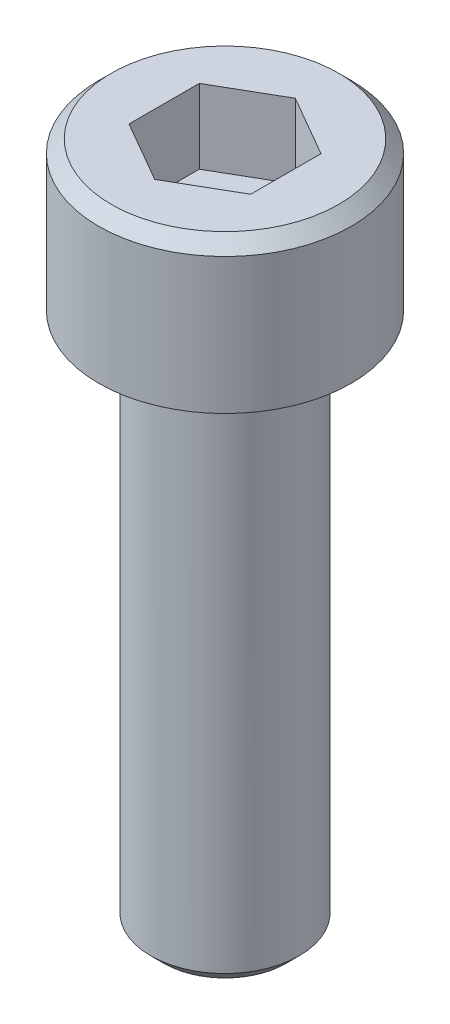
ISO-10303-21;
HEADER;
FILE_DESCRIPTION(('STEP AP214'),'2;1');
FILE_NAME('part.step','',(''),(''),'','','');
FILE_SCHEMA(('AUTOMOTIVE_DESIGN { 1 0 10303 214 1 1 1 1 }'));
ENDSEC;
DATA;
#1=APPLICATION_CONTEXT('core data for automotive mechanical design processes');
#2=APPLICATION_PROTOCOL_DEFINITION('international standard','automotive_design',2000,#1);
#3=PRODUCT_CONTEXT('',#1,'mechanical');
#4=PRODUCT('Part','Part','',(#3));
#5=PRODUCT_RELATED_PRODUCT_CATEGORY('part','',(#4));
#6=PRODUCT_DEFINITION_FORMATION('','',#4);
#7=PRODUCT_DEFINITION_CONTEXT('part definition',#1,'design');
#8=PRODUCT_DEFINITION('design','',#6,#7);
#9=PRODUCT_DEFINITION_SHAPE('','',#8);
#10=(LENGTH_UNIT() NAMED_UNIT(*) SI_UNIT(.MILLI.,.METRE.));
#11=(NAMED_UNIT(*) PLANE_ANGLE_UNIT() SI_UNIT($,.RADIAN.));
#12=(NAMED_UNIT(*) SI_UNIT($,.STERADIAN.) SOLID_ANGLE_UNIT());
#13=UNCERTAINTY_MEASURE_WITH_UNIT(LENGTH_MEASURE(1.E-05),#10,'distance_accuracy_value','');
#14=(GEOMETRIC_REPRESENTATION_CONTEXT(3) GLOBAL_UNCERTAINTY_ASSIGNED_CONTEXT((#13)) GLOBAL_UNIT_ASSIGNED_CONTEXT((#10,
#11,#12)) REPRESENTATION_CONTEXT('',''));
#15=CARTESIAN_POINT('',(0.,0.,0.));
#16=DIRECTION('',(0.,0.,1.));
#17=DIRECTION('',(1.,0.,0.));
#18=AXIS2_PLACEMENT_3D('',#15,#16,#17);
#19=CARTESIAN_POINT('',(-2.0475,2.5,2.364249352));
#20=DIRECTION('',(0.,-1.,0.));
#21=DIRECTION('',(0.,0.,-1.));
#22=AXIS2_PLACEMENT_3D('',#19,#20,#21);
#23=PLANE('',#22);
#24=DIRECTION('',(0.866025403814798,0.,0.499999999947417));
#25=VECTOR('',#24,1.);
#26=CARTESIAN_POINT('',(-1.02375,2.5,1.773187014));
#27=LINE('',#26,#25);
#28=CARTESIAN_POINT('',(-2.0475,2.5,1.182124676));
#29=VERTEX_POINT('',#28);
#30=CARTESIAN_POINT('',(1.14458746300339E-09,2.5,2.36424935133917));
#31=VERTEX_POINT('',#30);
#32=EDGE_CURVE('E78',#29,#31,#27,.T.);
#33=ORIENTED_EDGE('',*,*,#32,.T.);
#34=DIRECTION('',(0.866025403814798,0.,-0.499999999947417));
#35=VECTOR('',#34,1.);
#36=CARTESIAN_POINT('',(1.02375,2.5,1.773187014));
#37=LINE('',#36,#35);
#38=CARTESIAN_POINT('',(2.0475,2.5,1.182124676));
#39=VERTEX_POINT('',#38);
#40=EDGE_CURVE('E95',#31,#39,#37,.T.);
#41=ORIENTED_EDGE('',*,*,#40,.T.);
#42=DIRECTION('',(0.,0.,-1.));
#43=VECTOR('',#42,1.);
#44=CARTESIAN_POINT('',(2.0475,2.5,0.));
#45=LINE('',#44,#43);
#46=CARTESIAN_POINT('',(2.0475,2.5,-1.182124676));
#47=VERTEX_POINT('',#46);
#48=EDGE_CURVE('E98',#39,#47,#45,.T.);
#49=ORIENTED_EDGE('',*,*,#48,.T.);
#50=DIRECTION('',(-0.866025403814798,0.,-0.499999999947417));
#51=VECTOR('',#50,1.);
#52=CARTESIAN_POINT('',(1.02375,2.5,-1.773187014));
#53=LINE('',#52,#51);
#54=CARTESIAN_POINT('',(-1.14458746300339E-09,2.5,-2.36424935133917));
#55=VERTEX_POINT('',#54);
#56=EDGE_CURVE('E101',#47,#55,#53,.T.);
#57=ORIENTED_EDGE('',*,*,#56,.T.);
#58=DIRECTION('',(-0.866025403814798,0.,0.499999999947417));
#59=VECTOR('',#58,1.);
#60=CARTESIAN_POINT('',(-1.02375,2.5,-1.773187014));
#61=LINE('',#60,#59);
#62=CARTESIAN_POINT('',(-2.0475,2.5,-1.182124676));
#63=VERTEX_POINT('',#62);
#64=EDGE_CURVE('E80',#55,#63,#61,.T.);
#65=ORIENTED_EDGE('',*,*,#64,.T.);
#66=DIRECTION('',(0.,0.,1.));
#67=VECTOR('',#66,1.);
#68=CARTESIAN_POINT('',(-2.0475,2.5,0.));
#69=LINE('',#68,#67);
#70=EDGE_CURVE('E76',#63,#29,#69,.T.);
#71=ORIENTED_EDGE('',*,*,#70,.T.);
#72=EDGE_LOOP('',(#33,#41,#49,#57,#65,#71));
#73=FACE_BOUND('',#72,.T.);
#74=ADVANCED_FACE('F16',(#73),#23,.F.);
#75=CARTESIAN_POINT('',(-2.0475,2.5,-1.182124676));
#76=DIRECTION('',(-1.,0.,0.));
#77=DIRECTION('',(0.,0.,1.));
#78=AXIS2_PLACEMENT_3D('',#75,#76,#77);
#79=PLANE('',#78);
#80=DIRECTION('',(0.,-1.,0.));
#81=VECTOR('',#80,1.);
#82=CARTESIAN_POINT('',(-2.0475,3.75,1.182124676));
#83=LINE('',#82,#81);
#84=CARTESIAN_POINT('',(-2.04749999865846,5.,1.18212467509969));
#85=VERTEX_POINT('',#84);
#86=EDGE_CURVE('E82',#85,#29,#83,.T.);
#87=ORIENTED_EDGE('',*,*,#86,.T.);
#88=ORIENTED_EDGE('',*,*,#70,.F.);
#89=DIRECTION('',(0.,1.,0.));
#90=VECTOR('',#89,1.);
#91=CARTESIAN_POINT('',(-2.0475,3.75,-1.182124676));
#92=LINE('',#91,#90);
#93=CARTESIAN_POINT('',(-2.04749999865846,5.,-1.18212467509969));
#94=VERTEX_POINT('',#93);
#95=EDGE_CURVE('E50',#63,#94,#92,.T.);
#96=ORIENTED_EDGE('',*,*,#95,.T.);
#97=DIRECTION('',(0.,0.,-1.));
#98=VECTOR('',#97,1.);
#99=CARTESIAN_POINT('',(-2.0474999978004,5.,0.));
#100=LINE('',#99,#98);
#101=EDGE_CURVE('E56',#85,#94,#100,.T.);
#102=ORIENTED_EDGE('',*,*,#101,.F.);
#103=EDGE_LOOP('',(#87,#88,#96,#102));
#104=FACE_BOUND('',#103,.T.);
#105=ADVANCED_FACE('F83',(#104),#79,.F.);
#106=CARTESIAN_POINT('',(0.,2.5,-2.364249352));
#107=DIRECTION('',(-0.499999999947417,0.,-0.866025403814797));
#108=DIRECTION('',(-0.866025403814797,0.,0.499999999947417));
#109=AXIS2_PLACEMENT_3D('',#106,#107,#108);
#110=PLANE('',#109);
#111=ORIENTED_EDGE('',*,*,#95,.F.);
#112=ORIENTED_EDGE('',*,*,#64,.F.);
#113=DIRECTION('',(0.,1.,0.));
#114=VECTOR('',#113,1.);
#115=CARTESIAN_POINT('',(0.,3.75,-2.364249352));
#116=LINE('',#115,#114);
#117=CARTESIAN_POINT('',(2.08538635865938E-10,5.,-2.3642493506756));
#118=VERTEX_POINT('',#117);
#119=EDGE_CURVE('E100',#55,#118,#116,.T.);
#120=ORIENTED_EDGE('',*,*,#119,.T.);
#121=DIRECTION('',(0.866025403758618,0.,-0.500000000044723));
#122=VECTOR('',#121,1.);
#123=CARTESIAN_POINT('',(-2.0474999978004,5.,-1.1821246750368));
#124=LINE('',#123,#122);
#125=EDGE_CURVE('E20',#94,#118,#124,.T.);
#126=ORIENTED_EDGE('',*,*,#125,.F.);
#127=EDGE_LOOP('',(#111,#112,#120,#126));
#128=FACE_BOUND('',#127,.T.);
#129=ADVANCED_FACE('F133',(#128),#110,.F.);
#130=CARTESIAN_POINT('',(2.0475,2.5,-1.182124676));
#131=DIRECTION('',(0.499999999947417,0.,-0.866025403814797));
#132=DIRECTION('',(-0.866025403814797,0.,-0.499999999947417));
#133=AXIS2_PLACEMENT_3D('',#130,#131,#132);
#134=PLANE('',#133);
#135=ORIENTED_EDGE('',*,*,#119,.F.);
#136=ORIENTED_EDGE('',*,*,#56,.F.);
#137=DIRECTION('',(0.,1.,0.));
#138=VECTOR('',#137,1.);
#139=CARTESIAN_POINT('',(2.0475,3.75,-1.182124676));
#140=LINE('',#139,#138);
#141=CARTESIAN_POINT('',(2.04749999865846,5.,-1.18212467509969));
#142=VERTEX_POINT('',#141);
#143=EDGE_CURVE('E97',#47,#142,#140,.T.);
#144=ORIENTED_EDGE('',*,*,#143,.T.);
#145=DIRECTION('',(0.866025403758618,0.,0.500000000044723));
#146=VECTOR('',#145,1.);
#147=CARTESIAN_POINT('',(0.,5.,-2.3642493500736));
#148=LINE('',#147,#146);
#149=EDGE_CURVE('E108',#118,#142,#148,.T.);
#150=ORIENTED_EDGE('',*,*,#149,.F.);
#151=EDGE_LOOP('',(#135,#136,#144,#150));
#152=FACE_BOUND('',#151,.T.);
#153=ADVANCED_FACE('F137',(#152),#134,.F.);
#154=CARTESIAN_POINT('',(2.0475,2.5,1.182124676));
#155=DIRECTION('',(1.,0.,0.));
#156=DIRECTION('',(0.,0.,-1.));
#157=AXIS2_PLACEMENT_3D('',#154,#155,#156);
#158=PLANE('',#157);
#159=ORIENTED_EDGE('',*,*,#143,.F.);
#160=ORIENTED_EDGE('',*,*,#48,.F.);
#161=DIRECTION('',(0.,1.,0.));
#162=VECTOR('',#161,1.);
#163=CARTESIAN_POINT('',(2.0475,3.75,1.182124676));
#164=LINE('',#163,#162);
#165=CARTESIAN_POINT('',(2.04749999865846,5.,1.18212467509969));
#166=VERTEX_POINT('',#165);
#167=EDGE_CURVE('E86',#39,#166,#164,.T.);
#168=ORIENTED_EDGE('',*,*,#167,.T.);
#169=DIRECTION('',(0.,0.,1.));
#170=VECTOR('',#169,1.);
#171=CARTESIAN_POINT('',(2.0474999978004,5.,0.));
#172=LINE('',#171,#170);
#173=EDGE_CURVE('E105',#142,#166,#172,.T.);
#174=ORIENTED_EDGE('',*,*,#173,.F.);
#175=EDGE_LOOP('',(#159,#160,#168,#174));
#176=FACE_BOUND('',#175,.T.);
#177=ADVANCED_FACE('F142',(#176),#158,.F.);
#178=CARTESIAN_POINT('',(0.,2.5,2.364249352));
#179=DIRECTION('',(0.499999999947417,0.,0.866025403814797));
#180=DIRECTION('',(0.866025403814797,0.,-0.499999999947417));
#181=AXIS2_PLACEMENT_3D('',#178,#179,#180);
#182=PLANE('',#181);
#183=ORIENTED_EDGE('',*,*,#167,.F.);
#184=ORIENTED_EDGE('',*,*,#40,.F.);
#185=DIRECTION('',(0.,1.,0.));
#186=VECTOR('',#185,1.);
#187=CARTESIAN_POINT('',(0.,3.75,2.364249352));
#188=LINE('',#187,#186);
#189=CARTESIAN_POINT('',(-2.08538527445721E-10,5.,2.3642493506756));
#190=VERTEX_POINT('',#189);
#191=EDGE_CURVE('E35',#31,#190,#188,.T.);
#192=ORIENTED_EDGE('',*,*,#191,.T.);
#193=DIRECTION('',(-0.866025403758618,0.,0.500000000044722));
#194=VECTOR('',#193,1.);
#195=CARTESIAN_POINT('',(2.0474999978004,5.,1.1821246750368));
#196=LINE('',#195,#194);
#197=EDGE_CURVE('E107',#166,#190,#196,.T.);
#198=ORIENTED_EDGE('',*,*,#197,.F.);
#199=EDGE_LOOP('',(#183,#184,#192,#198));
#200=FACE_BOUND('',#199,.T.);
#201=ADVANCED_FACE('F144',(#200),#182,.F.);
#202=CARTESIAN_POINT('',(-2.0475,2.5,1.182124676));
#203=DIRECTION('',(-0.499999999947417,0.,0.866025403814797));
#204=DIRECTION('',(0.866025403814797,0.,0.499999999947417));
#205=AXIS2_PLACEMENT_3D('',#202,#203,#204);
#206=PLANE('',#205);
#207=ORIENTED_EDGE('',*,*,#191,.F.);
#208=ORIENTED_EDGE('',*,*,#32,.F.);
#209=ORIENTED_EDGE('',*,*,#86,.F.);
#210=DIRECTION('',(-0.866025403758618,0.,-0.500000000044722));
#211=VECTOR('',#210,1.);
#212=CARTESIAN_POINT('',(0.,5.,2.3642493500736));
#213=LINE('',#212,#211);
#214=EDGE_CURVE('E123',#190,#85,#213,.T.);
#215=ORIENTED_EDGE('',*,*,#214,.F.);
#216=EDGE_LOOP('',(#207,#208,#209,#215));
#217=FACE_BOUND('',#216,.T.);
#218=ADVANCED_FACE('F88',(#217),#206,.F.);
#219=CARTESIAN_POINT('',(-3.8709,5.,-3.8709));
#220=DIRECTION('',(0.,1.,0.));
#221=DIRECTION('',(0.,0.,1.));
#222=AXIS2_PLACEMENT_3D('',#219,#220,#221);
#223=PLANE('',#222);
#224=ORIENTED_EDGE('',*,*,#197,.T.);
#225=ORIENTED_EDGE('',*,*,#214,.T.);
#226=ORIENTED_EDGE('',*,*,#101,.T.);
#227=ORIENTED_EDGE('',*,*,#125,.T.);
#228=ORIENTED_EDGE('',*,*,#149,.T.);
#229=ORIENTED_EDGE('',*,*,#173,.T.);
#230=EDGE_LOOP('',(#224,#225,#226,#227,#228,#229));
#231=FACE_BOUND('',#230,.T.);
#232=CARTESIAN_POINT('',(0.,5.,0.));
#233=DIRECTION('',(0.,-1.,0.));
#234=DIRECTION('',(1.,0.,0.));
#235=AXIS2_PLACEMENT_3D('',#232,#233,#234);
#236=CIRCLE('',#235,3.825);
#237=CARTESIAN_POINT('',(3.825,5.,0.));
#238=VERTEX_POINT('',#237);
#239=EDGE_CURVE('E120',#238,#238,#236,.F.);
#240=ORIENTED_EDGE('',*,*,#239,.T.);
#241=EDGE_LOOP('',(#240));
#242=FACE_BOUND('',#241,.T.);
#243=ADVANCED_FACE('F130',(#231,#242),#223,.T.);
#244=CARTESIAN_POINT('',(0.,5.,0.));
#245=DIRECTION('',(0.,-1.,0.));
#246=DIRECTION('',(1.,0.,0.));
#247=AXIS2_PLACEMENT_3D('',#244,#245,#246);
#248=CONICAL_SURFACE('',#247,3.825,0.785398163397449);
#249=ORIENTED_EDGE('',*,*,#239,.F.);
#250=EDGE_LOOP('',(#249));
#251=FACE_BOUND('',#250,.T.);
#252=CARTESIAN_POINT('',(0.,4.575,0.));
#253=DIRECTION('',(0.,-1.,0.));
#254=DIRECTION('',(0.,0.,-1.));
#255=AXIS2_PLACEMENT_3D('',#252,#253,#254);
#256=CIRCLE('',#255,4.25);
#257=CARTESIAN_POINT('',(0.,4.575,-4.25));
#258=VERTEX_POINT('',#257);
#259=EDGE_CURVE('E93',#258,#258,#256,.F.);
#260=ORIENTED_EDGE('',*,*,#259,.T.);
#261=EDGE_LOOP('',(#260));
#262=FACE_BOUND('',#261,.T.);
#263=ADVANCED_FACE('F174',(#251,#262),#248,.T.);
#264=CARTESIAN_POINT('',(-2.07966,-18.,2.07966));
#265=DIRECTION('',(0.,-1.,0.));
#266=DIRECTION('',(0.,0.,-1.));
#267=AXIS2_PLACEMENT_3D('',#264,#265,#266);
#268=PLANE('',#267);
#269=CARTESIAN_POINT('',(0.,-18.,0.));
#270=DIRECTION('',(0.,1.,0.));
#271=DIRECTION('',(0.,0.,1.));
#272=AXIS2_PLACEMENT_3D('',#269,#270,#271);
#273=CIRCLE('',#272,2.05499999999999);
#274=CARTESIAN_POINT('',(0.,-18.,2.05499999999999));
#275=VERTEX_POINT('',#274);
#276=EDGE_CURVE('E117',#275,#275,#273,.F.);
#277=ORIENTED_EDGE('',*,*,#276,.T.);
#278=EDGE_LOOP('',(#277));
#279=FACE_BOUND('',#278,.T.);
#280=ADVANCED_FACE('F172',(#279),#268,.T.);
#281=CARTESIAN_POINT('',(0.,4.575,0.));
#282=DIRECTION('',(0.,-1.,0.));
#283=DIRECTION('',(1.,0.,0.));
#284=AXIS2_PLACEMENT_3D('',#281,#282,#283);
#285=CYLINDRICAL_SURFACE('',#284,4.25);
#286=ORIENTED_EDGE('',*,*,#259,.F.);
#287=EDGE_LOOP('',(#286));
#288=FACE_BOUND('',#287,.T.);
#289=CARTESIAN_POINT('',(0.,0.,0.));
#290=DIRECTION('',(0.,-1.,0.));
#291=DIRECTION('',(1.,0.,0.));
#292=AXIS2_PLACEMENT_3D('',#289,#290,#291);
#293=CIRCLE('',#292,4.25);
#294=CARTESIAN_POINT('',(4.25,0.,0.));
#295=VERTEX_POINT('',#294);
#296=EDGE_CURVE('E114',#295,#295,#293,.T.);
#297=ORIENTED_EDGE('',*,*,#296,.F.);
#298=EDGE_LOOP('',(#297));
#299=FACE_BOUND('',#298,.T.);
#300=ADVANCED_FACE('F168',(#288,#299),#285,.T.);
#301=CARTESIAN_POINT('',(0.,-18.,0.));
#302=DIRECTION('',(0.,1.,0.));
#303=DIRECTION('',(0.,0.,1.));
#304=AXIS2_PLACEMENT_3D('',#301,#302,#303);
#305=CONICAL_SURFACE('',#304,2.055,0.785398163397447);
#306=CARTESIAN_POINT('',(0.,-17.555,0.));
#307=DIRECTION('',(0.,-1.,0.));
#308=DIRECTION('',(0.,0.,-1.));
#309=AXIS2_PLACEMENT_3D('',#306,#307,#308);
#310=CIRCLE('',#309,2.5);
#311=CARTESIAN_POINT('',(0.,-17.555,-2.5));
#312=VERTEX_POINT('',#311);
#313=EDGE_CURVE('E26',#312,#312,#310,.T.);
#314=ORIENTED_EDGE('',*,*,#313,.T.);
#315=EDGE_LOOP('',(#314));
#316=FACE_BOUND('',#315,.T.);
#317=ORIENTED_EDGE('',*,*,#276,.F.);
#318=EDGE_LOOP('',(#317));
#319=FACE_BOUND('',#318,.T.);
#320=ADVANCED_FACE('F161',(#316,#319),#305,.T.);
#321=CARTESIAN_POINT('',(-4.301,0.,4.301));
#322=DIRECTION('',(0.,-1.,0.));
#323=DIRECTION('',(0.,0.,-1.));
#324=AXIS2_PLACEMENT_3D('',#321,#322,#323);
#325=PLANE('',#324);
#326=CARTESIAN_POINT('',(0.,0.,0.));
#327=DIRECTION('',(0.,-1.,0.));
#328=DIRECTION('',(0.,0.,-1.));
#329=AXIS2_PLACEMENT_3D('',#326,#327,#328);
#330=CIRCLE('',#329,2.5);
#331=CARTESIAN_POINT('',(0.,0.,-2.5));
#332=VERTEX_POINT('',#331);
#333=EDGE_CURVE('E10',#332,#332,#330,.F.);
#334=ORIENTED_EDGE('',*,*,#333,.T.);
#335=EDGE_LOOP('',(#334));
#336=FACE_BOUND('',#335,.T.);
#337=ORIENTED_EDGE('',*,*,#296,.T.);
#338=EDGE_LOOP('',(#337));
#339=FACE_BOUND('',#338,.T.);
#340=ADVANCED_FACE('F18',(#336,#339),#325,.T.);
#341=CARTESIAN_POINT('',(0.,0.,0.));
#342=DIRECTION('',(0.,-1.,0.));
#343=DIRECTION('',(0.,0.,-1.));
#344=AXIS2_PLACEMENT_3D('',#341,#342,#343);
#345=CYLINDRICAL_SURFACE('',#344,2.5);
#346=ORIENTED_EDGE('',*,*,#313,.F.);
#347=EDGE_LOOP('',(#346));
#348=FACE_BOUND('',#347,.T.);
#349=ORIENTED_EDGE('',*,*,#333,.F.);
#350=EDGE_LOOP('',(#349));
#351=FACE_BOUND('',#350,.T.);
#352=ADVANCED_FACE('F154',(#348,#351),#345,.T.);
#353=CLOSED_SHELL('',(#74,#105,#129,#153,#177,#201,#218,#243,#263,#280,#300,#320,#340,#352));
#354=MANIFOLD_SOLID_BREP('B1',#353);
#355=ADVANCED_BREP_SHAPE_REPRESENTATION('',(#18,#354),#14);
#356=SHAPE_DEFINITION_REPRESENTATION(#9,#355);
ENDSEC;
END-ISO-10303-21;
